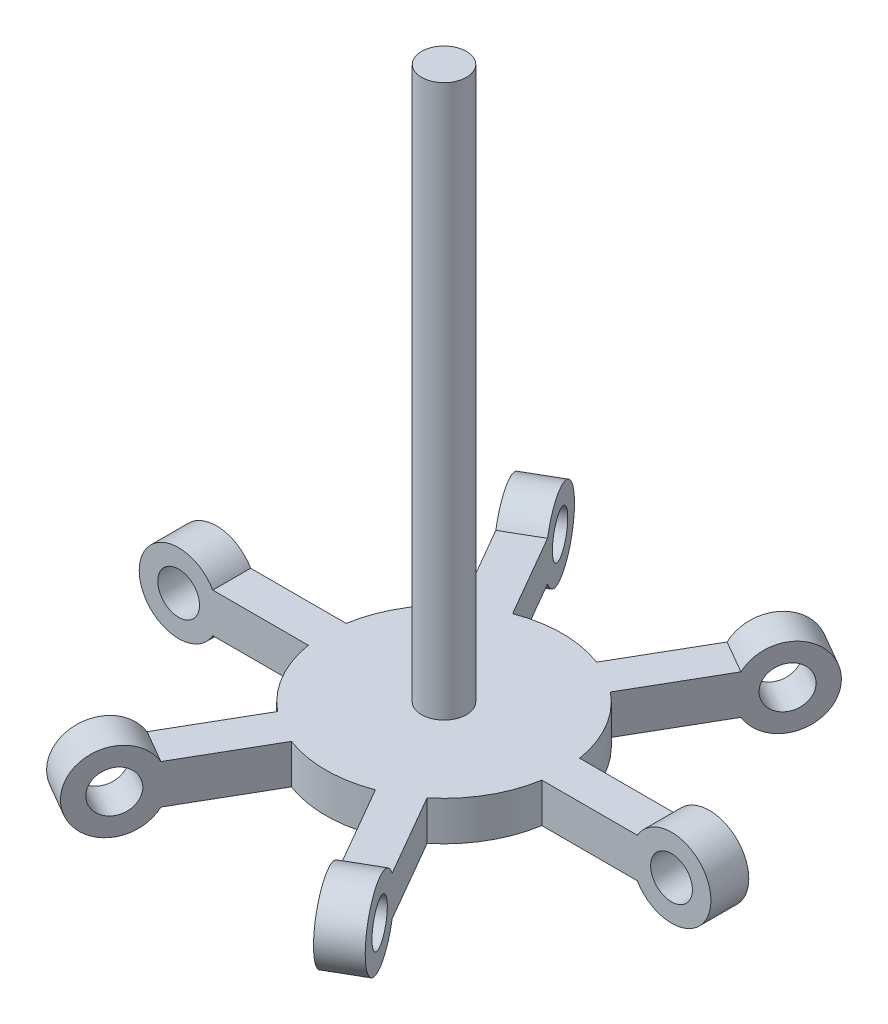
ISO-10303-21;
HEADER;
FILE_DESCRIPTION(('STEP AP214'),'2;1');
FILE_NAME('part.step','',(''),(''),'','','');
FILE_SCHEMA(('AUTOMOTIVE_DESIGN { 1 0 10303 214 1 1 1 1 }'));
ENDSEC;
DATA;
#1=APPLICATION_CONTEXT('core data for automotive mechanical design processes');
#2=APPLICATION_PROTOCOL_DEFINITION('international standard','automotive_design',2000,#1);
#3=PRODUCT_CONTEXT('',#1,'mechanical');
#4=PRODUCT('Part','Part','',(#3));
#5=PRODUCT_RELATED_PRODUCT_CATEGORY('part','',(#4));
#6=PRODUCT_DEFINITION_FORMATION('','',#4);
#7=PRODUCT_DEFINITION_CONTEXT('part definition',#1,'design');
#8=PRODUCT_DEFINITION('design','',#6,#7);
#9=PRODUCT_DEFINITION_SHAPE('','',#8);
#10=(LENGTH_UNIT() NAMED_UNIT(*) SI_UNIT(.MILLI.,.METRE.));
#11=(NAMED_UNIT(*) PLANE_ANGLE_UNIT() SI_UNIT($,.RADIAN.));
#12=(NAMED_UNIT(*) SI_UNIT($,.STERADIAN.) SOLID_ANGLE_UNIT());
#13=UNCERTAINTY_MEASURE_WITH_UNIT(LENGTH_MEASURE(1.E-05),#10,'distance_accuracy_value','');
#14=(GEOMETRIC_REPRESENTATION_CONTEXT(3) GLOBAL_UNCERTAINTY_ASSIGNED_CONTEXT((#13)) GLOBAL_UNIT_ASSIGNED_CONTEXT((#10,
#11,#12)) REPRESENTATION_CONTEXT('',''));
#15=CARTESIAN_POINT('',(0.,0.,0.));
#16=DIRECTION('',(0.,0.,1.));
#17=DIRECTION('',(1.,0.,0.));
#18=AXIS2_PLACEMENT_3D('',#15,#16,#17);
#19=CARTESIAN_POINT('',(0.,5.,0.));
#20=DIRECTION('',(0.,-1.,0.));
#21=DIRECTION('',(0.,0.,-1.));
#22=AXIS2_PLACEMENT_3D('',#19,#20,#21);
#23=CYLINDRICAL_SURFACE('',#22,30.);
#24=DIRECTION('',(0.,-1.,0.));
#25=VECTOR('',#24,1.);
#26=CARTESIAN_POINT('',(10.6498332769387,5.,28.0460523277949));
#27=LINE('',#26,#25);
#28=CARTESIAN_POINT('',(10.6498332769387,5.,28.0460523277949));
#29=VERTEX_POINT('',#28);
#30=CARTESIAN_POINT('',(10.6498332769387,-5.,28.0460523277949));
#31=VERTEX_POINT('',#30);
#32=EDGE_CURVE('E231',#29,#31,#27,.T.);
#33=ORIENTED_EDGE('',*,*,#32,.F.);
#34=CARTESIAN_POINT('',(0.,5.,0.));
#35=DIRECTION('',(0.,1.,0.));
#36=DIRECTION('',(0.,0.,1.));
#37=AXIS2_PLACEMENT_3D('',#34,#35,#36);
#38=CIRCLE('',#37,30.);
#39=CARTESIAN_POINT('',(-10.6498332769381,5.,28.0460523277951));
#40=VERTEX_POINT('',#39);
#41=EDGE_CURVE('E405',#40,#29,#38,.T.);
#42=ORIENTED_EDGE('',*,*,#41,.F.);
#43=DIRECTION('',(0.,-1.,0.));
#44=VECTOR('',#43,1.);
#45=CARTESIAN_POINT('',(-10.6498332769381,5.,28.0460523277951));
#46=LINE('',#45,#44);
#47=CARTESIAN_POINT('',(-10.6498332769381,-5.,28.0460523277951));
#48=VERTEX_POINT('',#47);
#49=EDGE_CURVE('E245',#48,#40,#46,.F.);
#50=ORIENTED_EDGE('',*,*,#49,.F.);
#51=CARTESIAN_POINT('',(0.,-5.,0.));
#52=DIRECTION('',(0.,1.,0.));
#53=DIRECTION('',(0.,0.,1.));
#54=AXIS2_PLACEMENT_3D('',#51,#52,#53);
#55=CIRCLE('',#54,30.);
#56=EDGE_CURVE('E225',#48,#31,#55,.T.);
#57=ORIENTED_EDGE('',*,*,#56,.T.);
#58=EDGE_LOOP('',(#33,#42,#50,#57));
#59=FACE_BOUND('',#58,.T.);
#60=ADVANCED_FACE('F41',(#59),#23,.T.);
#61=DIRECTION('',(0.,-1.,0.));
#62=VECTOR('',#61,1.);
#63=CARTESIAN_POINT('',(18.9636771532693,5.,23.2460523277948));
#64=LINE('',#63,#62);
#65=CARTESIAN_POINT('',(18.9636771532693,-5.,23.2460523277948));
#66=VERTEX_POINT('',#65);
#67=CARTESIAN_POINT('',(18.9636771532693,5.,23.2460523277948));
#68=VERTEX_POINT('',#67);
#69=EDGE_CURVE('E212',#66,#68,#64,.F.);
#70=ORIENTED_EDGE('',*,*,#69,.F.);
#71=CARTESIAN_POINT('',(29.6135104302074,-5.,4.8));
#72=VERTEX_POINT('',#71);
#73=EDGE_CURVE('E218',#66,#72,#55,.T.);
#74=ORIENTED_EDGE('',*,*,#73,.T.);
#75=DIRECTION('',(0.,-1.,0.));
#76=VECTOR('',#75,1.);
#77=CARTESIAN_POINT('',(29.6135104302074,5.,4.8));
#78=LINE('',#77,#76);
#79=CARTESIAN_POINT('',(29.6135104302074,5.,4.8));
#80=VERTEX_POINT('',#79);
#81=EDGE_CURVE('E226',#80,#72,#78,.T.);
#82=ORIENTED_EDGE('',*,*,#81,.F.);
#83=EDGE_CURVE('E52',#68,#80,#38,.T.);
#84=ORIENTED_EDGE('',*,*,#83,.F.);
#85=EDGE_LOOP('',(#70,#74,#82,#84));
#86=FACE_BOUND('',#85,.T.);
#87=ADVANCED_FACE('F230',(#86),#23,.T.);
#88=DIRECTION('',(0.,-1.,0.));
#89=VECTOR('',#88,1.);
#90=CARTESIAN_POINT('',(-18.9636771532688,5.,23.2460523277952));
#91=LINE('',#90,#89);
#92=CARTESIAN_POINT('',(-18.9636771532688,5.,23.2460523277952));
#93=VERTEX_POINT('',#92);
#94=CARTESIAN_POINT('',(-18.9636771532688,-5.,23.2460523277952));
#95=VERTEX_POINT('',#94);
#96=EDGE_CURVE('E251',#93,#95,#91,.T.);
#97=ORIENTED_EDGE('',*,*,#96,.F.);
#98=CARTESIAN_POINT('',(-29.6135104302074,5.,4.8));
#99=VERTEX_POINT('',#98);
#100=EDGE_CURVE('E441',#99,#93,#38,.T.);
#101=ORIENTED_EDGE('',*,*,#100,.F.);
#102=DIRECTION('',(0.,-1.,0.));
#103=VECTOR('',#102,1.);
#104=CARTESIAN_POINT('',(-29.6135104302074,5.,4.8));
#105=LINE('',#104,#103);
#106=CARTESIAN_POINT('',(-29.6135104302074,-5.,4.8));
#107=VERTEX_POINT('',#106);
#108=EDGE_CURVE('E260',#107,#99,#105,.F.);
#109=ORIENTED_EDGE('',*,*,#108,.F.);
#110=EDGE_CURVE('E455',#107,#95,#55,.T.);
#111=ORIENTED_EDGE('',*,*,#110,.T.);
#112=EDGE_LOOP('',(#97,#101,#109,#111));
#113=FACE_BOUND('',#112,.T.);
#114=ADVANCED_FACE('F475',(#113),#23,.T.);
#115=DIRECTION('',(0.,-1.,0.));
#116=VECTOR('',#115,1.);
#117=CARTESIAN_POINT('',(-29.6135104302074,5.,-4.8));
#118=LINE('',#117,#116);
#119=CARTESIAN_POINT('',(-29.6135104302074,5.,-4.8));
#120=VERTEX_POINT('',#119);
#121=CARTESIAN_POINT('',(-29.6135104302074,-5.,-4.8));
#122=VERTEX_POINT('',#121);
#123=EDGE_CURVE('E266',#120,#122,#118,.T.);
#124=ORIENTED_EDGE('',*,*,#123,.F.);
#125=CARTESIAN_POINT('',(-18.9636771532691,5.,-23.2460523277949));
#126=VERTEX_POINT('',#125);
#127=EDGE_CURVE('E439',#126,#120,#38,.T.);
#128=ORIENTED_EDGE('',*,*,#127,.F.);
#129=DIRECTION('',(0.,-1.,0.));
#130=VECTOR('',#129,1.);
#131=CARTESIAN_POINT('',(-18.9636771532691,5.,-23.2460523277949));
#132=LINE('',#131,#130);
#133=CARTESIAN_POINT('',(-18.9636771532691,-5.,-23.2460523277949));
#134=VERTEX_POINT('',#133);
#135=EDGE_CURVE('E275',#134,#126,#132,.F.);
#136=ORIENTED_EDGE('',*,*,#135,.F.);
#137=EDGE_CURVE('E456',#134,#122,#55,.T.);
#138=ORIENTED_EDGE('',*,*,#137,.T.);
#139=EDGE_LOOP('',(#124,#128,#136,#138));
#140=FACE_BOUND('',#139,.T.);
#141=ADVANCED_FACE('F463',(#140),#23,.T.);
#142=DIRECTION('',(0.,-1.,0.));
#143=VECTOR('',#142,1.);
#144=CARTESIAN_POINT('',(-10.6498332769385,5.,-28.046052327795));
#145=LINE('',#144,#143);
#146=CARTESIAN_POINT('',(-10.6498332769385,5.,-28.046052327795));
#147=VERTEX_POINT('',#146);
#148=CARTESIAN_POINT('',(-10.6498332769385,-5.,-28.046052327795));
#149=VERTEX_POINT('',#148);
#150=EDGE_CURVE('E281',#147,#149,#145,.T.);
#151=ORIENTED_EDGE('',*,*,#150,.F.);
#152=CARTESIAN_POINT('',(10.6498332769383,5.,-28.046052327795));
#153=VERTEX_POINT('',#152);
#154=EDGE_CURVE('E50',#153,#147,#38,.T.);
#155=ORIENTED_EDGE('',*,*,#154,.F.);
#156=DIRECTION('',(0.,-1.,0.));
#157=VECTOR('',#156,1.);
#158=CARTESIAN_POINT('',(10.6498332769383,5.,-28.046052327795));
#159=LINE('',#158,#157);
#160=CARTESIAN_POINT('',(10.6498332769383,-5.,-28.046052327795));
#161=VERTEX_POINT('',#160);
#162=EDGE_CURVE('E290',#161,#153,#159,.F.);
#163=ORIENTED_EDGE('',*,*,#162,.F.);
#164=EDGE_CURVE('E325',#161,#149,#55,.T.);
#165=ORIENTED_EDGE('',*,*,#164,.T.);
#166=EDGE_LOOP('',(#151,#155,#163,#165));
#167=FACE_BOUND('',#166,.T.);
#168=ADVANCED_FACE('F437',(#167),#23,.T.);
#169=DIRECTION('',(0.,-1.,0.));
#170=VECTOR('',#169,1.);
#171=CARTESIAN_POINT('',(18.9636771532689,5.,-23.2460523277951));
#172=LINE('',#171,#170);
#173=CARTESIAN_POINT('',(18.9636771532689,5.,-23.2460523277951));
#174=VERTEX_POINT('',#173);
#175=CARTESIAN_POINT('',(18.9636771532689,-5.,-23.2460523277951));
#176=VERTEX_POINT('',#175);
#177=EDGE_CURVE('E296',#174,#176,#172,.T.);
#178=ORIENTED_EDGE('',*,*,#177,.F.);
#179=CARTESIAN_POINT('',(29.6135104302074,5.,-4.8));
#180=VERTEX_POINT('',#179);
#181=EDGE_CURVE('E11',#180,#174,#38,.T.);
#182=ORIENTED_EDGE('',*,*,#181,.F.);
#183=DIRECTION('',(0.,-1.,0.));
#184=VECTOR('',#183,1.);
#185=CARTESIAN_POINT('',(29.6135104302074,5.,-4.8));
#186=LINE('',#185,#184);
#187=CARTESIAN_POINT('',(29.6135104302074,-5.,-4.8));
#188=VERTEX_POINT('',#187);
#189=EDGE_CURVE('E319',#188,#180,#186,.F.);
#190=ORIENTED_EDGE('',*,*,#189,.F.);
#191=EDGE_CURVE('E228',#188,#176,#55,.T.);
#192=ORIENTED_EDGE('',*,*,#191,.T.);
#193=EDGE_LOOP('',(#178,#182,#190,#192));
#194=FACE_BOUND('',#193,.T.);
#195=ADVANCED_FACE('F43',(#194),#23,.T.);
#196=CARTESIAN_POINT('',(0.,5.,0.));
#197=DIRECTION('',(0.,1.,0.));
#198=DIRECTION('',(0.,0.,1.));
#199=AXIS2_PLACEMENT_3D('',#196,#197,#198);
#200=PLANE('',#199);
#201=CARTESIAN_POINT('',(0.,5.,0.));
#202=DIRECTION('',(0.,1.,0.));
#203=DIRECTION('',(0.,0.,1.));
#204=AXIS2_PLACEMENT_3D('',#201,#202,#203);
#205=CIRCLE('',#204,5.7);
#206=CARTESIAN_POINT('',(0.,5.,5.7));
#207=VERTEX_POINT('',#206);
#208=EDGE_CURVE('E787',#207,#207,#205,.T.);
#209=ORIENTED_EDGE('',*,*,#208,.F.);
#210=EDGE_LOOP('',(#209));
#211=FACE_BOUND('',#210,.T.);
#212=DIRECTION('',(-0.866025403784433,0.,0.50000000000001));
#213=VECTOR('',#212,1.);
#214=CARTESIAN_POINT('',(31.0767949192436,5.,44.2265877365271));
#215=LINE('',#214,#213);
#216=CARTESIAN_POINT('',(31.0767949192436,5.,44.2265877365271));
#217=VERTEX_POINT('',#216);
#218=CARTESIAN_POINT('',(22.7629510429131,5.,49.0265877365271));
#219=VERTEX_POINT('',#218);
#220=EDGE_CURVE('E353',#217,#219,#215,.T.);
#221=ORIENTED_EDGE('',*,*,#220,.F.);
#222=DIRECTION('',(-0.50000000000001,0.,-0.866025403784433));
#223=VECTOR('',#222,1.);
#224=CARTESIAN_POINT('',(39.156921938166,5.,58.2217782649103));
#225=LINE('',#224,#223);
#226=EDGE_CURVE('E232',#217,#68,#225,.T.);
#227=ORIENTED_EDGE('',*,*,#226,.T.);
#228=ORIENTED_EDGE('',*,*,#83,.T.);
#229=DIRECTION('',(1.,0.,0.));
#230=VECTOR('',#229,1.);
#231=CARTESIAN_POINT('',(70.,5.,4.8));
#232=LINE('',#231,#230);
#233=CARTESIAN_POINT('',(53.8397459621556,5.,4.8));
#234=VERTEX_POINT('',#233);
#235=EDGE_CURVE('E314',#80,#234,#232,.T.);
#236=ORIENTED_EDGE('',*,*,#235,.T.);
#237=DIRECTION('',(0.,0.,1.));
#238=VECTOR('',#237,1.);
#239=CARTESIAN_POINT('',(53.8397459621556,5.,-4.79999999999999));
#240=LINE('',#239,#238);
#241=CARTESIAN_POINT('',(53.8397459621556,5.,-4.8));
#242=VERTEX_POINT('',#241);
#243=EDGE_CURVE('E311',#242,#234,#240,.T.);
#244=ORIENTED_EDGE('',*,*,#243,.F.);
#245=DIRECTION('',(-1.,0.,0.));
#246=VECTOR('',#245,1.);
#247=CARTESIAN_POINT('',(70.,5.,-4.8));
#248=LINE('',#247,#246);
#249=EDGE_CURVE('E316',#242,#180,#248,.T.);
#250=ORIENTED_EDGE('',*,*,#249,.T.);
#251=ORIENTED_EDGE('',*,*,#181,.T.);
#252=DIRECTION('',(0.499999999999998,0.,-0.86602540378444));
#253=VECTOR('',#252,1.);
#254=CARTESIAN_POINT('',(39.1569219381652,5.,-58.2217782649108));
#255=LINE('',#254,#253);
#256=CARTESIAN_POINT('',(31.076794919243,5.,-44.2265877365275));
#257=VERTEX_POINT('',#256);
#258=EDGE_CURVE('E285',#174,#257,#255,.T.);
#259=ORIENTED_EDGE('',*,*,#258,.T.);
#260=DIRECTION('',(0.86602540378444,0.,0.499999999999998));
#261=VECTOR('',#260,1.);
#262=CARTESIAN_POINT('',(22.7629510429124,5.,-49.0265877365275));
#263=LINE('',#262,#261);
#264=CARTESIAN_POINT('',(22.7629510429124,5.,-49.0265877365275));
#265=VERTEX_POINT('',#264);
#266=EDGE_CURVE('E396',#265,#257,#263,.T.);
#267=ORIENTED_EDGE('',*,*,#266,.F.);
#268=DIRECTION('',(-0.499999999999998,0.,0.86602540378444));
#269=VECTOR('',#268,1.);
#270=CARTESIAN_POINT('',(30.8430780618346,5.,-63.0217782649108));
#271=LINE('',#270,#269);
#272=EDGE_CURVE('E287',#265,#153,#271,.T.);
#273=ORIENTED_EDGE('',*,*,#272,.T.);
#274=ORIENTED_EDGE('',*,*,#154,.T.);
#275=DIRECTION('',(-0.500000000000004,0.,-0.866025403784436));
#276=VECTOR('',#275,1.);
#277=CARTESIAN_POINT('',(-30.843078061835,5.,-63.0217782649106));
#278=LINE('',#277,#276);
#279=CARTESIAN_POINT('',(-22.7629510429127,5.,-49.0265877365273));
#280=VERTEX_POINT('',#279);
#281=EDGE_CURVE('E270',#147,#280,#278,.T.);
#282=ORIENTED_EDGE('',*,*,#281,.T.);
#283=DIRECTION('',(0.866025403784436,0.,-0.500000000000004));
#284=VECTOR('',#283,1.);
#285=CARTESIAN_POINT('',(-31.0767949192433,5.,-44.2265877365273));
#286=LINE('',#285,#284);
#287=CARTESIAN_POINT('',(-31.0767949192433,5.,-44.2265877365273));
#288=VERTEX_POINT('',#287);
#289=EDGE_CURVE('E385',#288,#280,#286,.T.);
#290=ORIENTED_EDGE('',*,*,#289,.F.);
#291=DIRECTION('',(0.500000000000004,0.,0.866025403784436));
#292=VECTOR('',#291,1.);
#293=CARTESIAN_POINT('',(-39.1569219381656,5.,-58.2217782649105));
#294=LINE('',#293,#292);
#295=EDGE_CURVE('E272',#288,#126,#294,.T.);
#296=ORIENTED_EDGE('',*,*,#295,.T.);
#297=ORIENTED_EDGE('',*,*,#127,.T.);
#298=DIRECTION('',(-1.,0.,0.));
#299=VECTOR('',#298,1.);
#300=CARTESIAN_POINT('',(-70.,5.,-4.8));
#301=LINE('',#300,#299);
#302=CARTESIAN_POINT('',(-53.8397459621556,5.,-4.8));
#303=VERTEX_POINT('',#302);
#304=EDGE_CURVE('E255',#120,#303,#301,.T.);
#305=ORIENTED_EDGE('',*,*,#304,.T.);
#306=DIRECTION('',(0.,0.,-1.));
#307=VECTOR('',#306,1.);
#308=CARTESIAN_POINT('',(-53.8397459621556,5.,4.79999999999999));
#309=LINE('',#308,#307);
#310=CARTESIAN_POINT('',(-53.8397459621556,5.,4.8));
#311=VERTEX_POINT('',#310);
#312=EDGE_CURVE('E374',#311,#303,#309,.T.);
#313=ORIENTED_EDGE('',*,*,#312,.F.);
#314=DIRECTION('',(1.,0.,0.));
#315=VECTOR('',#314,1.);
#316=CARTESIAN_POINT('',(-70.,5.,4.8));
#317=LINE('',#316,#315);
#318=EDGE_CURVE('E257',#311,#99,#317,.T.);
#319=ORIENTED_EDGE('',*,*,#318,.T.);
#320=ORIENTED_EDGE('',*,*,#100,.T.);
#321=DIRECTION('',(-0.499999999999992,0.,0.866025403784443));
#322=VECTOR('',#321,1.);
#323=CARTESIAN_POINT('',(-39.1569219381648,5.,58.2217782649111));
#324=LINE('',#323,#322);
#325=CARTESIAN_POINT('',(-31.0767949192427,5.,44.2265877365277));
#326=VERTEX_POINT('',#325);
#327=EDGE_CURVE('E240',#93,#326,#324,.T.);
#328=ORIENTED_EDGE('',*,*,#327,.T.);
#329=DIRECTION('',(-0.866025403784443,0.,-0.499999999999992));
#330=VECTOR('',#329,1.);
#331=CARTESIAN_POINT('',(-22.7629510429121,5.,49.0265877365276));
#332=LINE('',#331,#330);
#333=CARTESIAN_POINT('',(-22.7629510429121,5.,49.0265877365276));
#334=VERTEX_POINT('',#333);
#335=EDGE_CURVE('E363',#334,#326,#332,.T.);
#336=ORIENTED_EDGE('',*,*,#335,.F.);
#337=DIRECTION('',(0.499999999999992,0.,-0.866025403784443));
#338=VECTOR('',#337,1.);
#339=CARTESIAN_POINT('',(-30.8430780618341,5.,63.021778264911));
#340=LINE('',#339,#338);
#341=EDGE_CURVE('E242',#334,#40,#340,.T.);
#342=ORIENTED_EDGE('',*,*,#341,.T.);
#343=ORIENTED_EDGE('',*,*,#41,.T.);
#344=DIRECTION('',(0.50000000000001,0.,0.866025403784433));
#345=VECTOR('',#344,1.);
#346=CARTESIAN_POINT('',(30.8430780618354,5.,63.0217782649103));
#347=LINE('',#346,#345);
#348=EDGE_CURVE('E67',#29,#219,#347,.T.);
#349=ORIENTED_EDGE('',*,*,#348,.T.);
#350=EDGE_LOOP('',(#221,#227,#228,#236,#244,#250,#251,#259,#267,#273,#274,#282,#290,#296,#297,
#305,#313,#319,#320,#328,#336,#342,#343,#349));
#351=FACE_BOUND('',#350,.T.);
#352=ADVANCED_FACE('F403',(#211,#351),#200,.T.);
#353=CARTESIAN_POINT('',(0.,-5.,0.));
#354=DIRECTION('',(0.,1.,0.));
#355=DIRECTION('',(0.,0.,1.));
#356=AXIS2_PLACEMENT_3D('',#353,#354,#355);
#357=PLANE('',#356);
#358=DIRECTION('',(-0.50000000000001,0.,-0.866025403784433));
#359=VECTOR('',#358,1.);
#360=CARTESIAN_POINT('',(39.156921938166,-5.,58.2217782649103));
#361=LINE('',#360,#359);
#362=CARTESIAN_POINT('',(31.0767949192436,-5.,44.2265877365271));
#363=VERTEX_POINT('',#362);
#364=EDGE_CURVE('E207',#363,#66,#361,.T.);
#365=ORIENTED_EDGE('',*,*,#364,.F.);
#366=DIRECTION('',(-0.866025403784433,0.,0.50000000000001));
#367=VECTOR('',#366,1.);
#368=CARTESIAN_POINT('',(31.0767949192436,-5.,44.2265877365271));
#369=LINE('',#368,#367);
#370=CARTESIAN_POINT('',(22.7629510429131,-5.,49.0265877365271));
#371=VERTEX_POINT('',#370);
#372=EDGE_CURVE('E59',#363,#371,#369,.T.);
#373=ORIENTED_EDGE('',*,*,#372,.T.);
#374=DIRECTION('',(0.50000000000001,0.,0.866025403784433));
#375=VECTOR('',#374,1.);
#376=CARTESIAN_POINT('',(30.8430780618354,-5.,63.0217782649103));
#377=LINE('',#376,#375);
#378=EDGE_CURVE('E215',#31,#371,#377,.T.);
#379=ORIENTED_EDGE('',*,*,#378,.F.);
#380=ORIENTED_EDGE('',*,*,#56,.F.);
#381=DIRECTION('',(0.499999999999992,0.,-0.866025403784443));
#382=VECTOR('',#381,1.);
#383=CARTESIAN_POINT('',(-30.8430780618341,-5.,63.021778264911));
#384=LINE('',#383,#382);
#385=CARTESIAN_POINT('',(-22.7629510429121,-5.,49.0265877365276));
#386=VERTEX_POINT('',#385);
#387=EDGE_CURVE('E243',#386,#48,#384,.T.);
#388=ORIENTED_EDGE('',*,*,#387,.F.);
#389=DIRECTION('',(-0.866025403784443,0.,-0.499999999999992));
#390=VECTOR('',#389,1.);
#391=CARTESIAN_POINT('',(-22.7629510429121,-5.,49.0265877365276));
#392=LINE('',#391,#390);
#393=CARTESIAN_POINT('',(-31.0767949192427,-5.,44.2265877365277));
#394=VERTEX_POINT('',#393);
#395=EDGE_CURVE('E359',#386,#394,#392,.T.);
#396=ORIENTED_EDGE('',*,*,#395,.T.);
#397=DIRECTION('',(-0.499999999999992,0.,0.866025403784443));
#398=VECTOR('',#397,1.);
#399=CARTESIAN_POINT('',(-39.1569219381648,-5.,58.2217782649111));
#400=LINE('',#399,#398);
#401=EDGE_CURVE('E235',#95,#394,#400,.T.);
#402=ORIENTED_EDGE('',*,*,#401,.F.);
#403=ORIENTED_EDGE('',*,*,#110,.F.);
#404=DIRECTION('',(1.,0.,0.));
#405=VECTOR('',#404,1.);
#406=CARTESIAN_POINT('',(-70.,-5.,4.8));
#407=LINE('',#406,#405);
#408=CARTESIAN_POINT('',(-53.8397459621556,-5.,4.8));
#409=VERTEX_POINT('',#408);
#410=EDGE_CURVE('E258',#409,#107,#407,.T.);
#411=ORIENTED_EDGE('',*,*,#410,.F.);
#412=DIRECTION('',(0.,0.,-1.));
#413=VECTOR('',#412,1.);
#414=CARTESIAN_POINT('',(-53.8397459621556,-5.,4.79999999999999));
#415=LINE('',#414,#413);
#416=CARTESIAN_POINT('',(-53.8397459621556,-5.,-4.8));
#417=VERTEX_POINT('',#416);
#418=EDGE_CURVE('E370',#409,#417,#415,.T.);
#419=ORIENTED_EDGE('',*,*,#418,.T.);
#420=DIRECTION('',(-1.,0.,0.));
#421=VECTOR('',#420,1.);
#422=CARTESIAN_POINT('',(-70.,-5.,-4.8));
#423=LINE('',#422,#421);
#424=EDGE_CURVE('E254',#122,#417,#423,.T.);
#425=ORIENTED_EDGE('',*,*,#424,.F.);
#426=ORIENTED_EDGE('',*,*,#137,.F.);
#427=DIRECTION('',(0.500000000000004,0.,0.866025403784436));
#428=VECTOR('',#427,1.);
#429=CARTESIAN_POINT('',(-39.1569219381656,-5.,-58.2217782649105));
#430=LINE('',#429,#428);
#431=CARTESIAN_POINT('',(-31.0767949192433,-5.,-44.2265877365273));
#432=VERTEX_POINT('',#431);
#433=EDGE_CURVE('E273',#432,#134,#430,.T.);
#434=ORIENTED_EDGE('',*,*,#433,.F.);
#435=DIRECTION('',(0.866025403784436,0.,-0.500000000000004));
#436=VECTOR('',#435,1.);
#437=CARTESIAN_POINT('',(-31.0767949192433,-5.,-44.2265877365273));
#438=LINE('',#437,#436);
#439=CARTESIAN_POINT('',(-22.7629510429127,-5.,-49.0265877365273));
#440=VERTEX_POINT('',#439);
#441=EDGE_CURVE('E381',#432,#440,#438,.T.);
#442=ORIENTED_EDGE('',*,*,#441,.T.);
#443=DIRECTION('',(-0.500000000000004,0.,-0.866025403784436));
#444=VECTOR('',#443,1.);
#445=CARTESIAN_POINT('',(-30.843078061835,-5.,-63.0217782649106));
#446=LINE('',#445,#444);
#447=EDGE_CURVE('E269',#149,#440,#446,.T.);
#448=ORIENTED_EDGE('',*,*,#447,.F.);
#449=ORIENTED_EDGE('',*,*,#164,.F.);
#450=DIRECTION('',(-0.499999999999998,0.,0.86602540378444));
#451=VECTOR('',#450,1.);
#452=CARTESIAN_POINT('',(30.8430780618346,-5.,-63.0217782649108));
#453=LINE('',#452,#451);
#454=CARTESIAN_POINT('',(22.7629510429124,-5.,-49.0265877365275));
#455=VERTEX_POINT('',#454);
#456=EDGE_CURVE('E288',#455,#161,#453,.T.);
#457=ORIENTED_EDGE('',*,*,#456,.F.);
#458=DIRECTION('',(0.86602540378444,0.,0.499999999999998));
#459=VECTOR('',#458,1.);
#460=CARTESIAN_POINT('',(22.7629510429124,-5.,-49.0265877365275));
#461=LINE('',#460,#459);
#462=CARTESIAN_POINT('',(31.076794919243,-5.,-44.2265877365275));
#463=VERTEX_POINT('',#462);
#464=EDGE_CURVE('E392',#455,#463,#461,.T.);
#465=ORIENTED_EDGE('',*,*,#464,.T.);
#466=DIRECTION('',(0.499999999999998,0.,-0.86602540378444));
#467=VECTOR('',#466,1.);
#468=CARTESIAN_POINT('',(39.1569219381652,-5.,-58.2217782649108));
#469=LINE('',#468,#467);
#470=EDGE_CURVE('E284',#176,#463,#469,.T.);
#471=ORIENTED_EDGE('',*,*,#470,.F.);
#472=ORIENTED_EDGE('',*,*,#191,.F.);
#473=DIRECTION('',(-1.,0.,0.));
#474=VECTOR('',#473,1.);
#475=CARTESIAN_POINT('',(70.,-5.,-4.8));
#476=LINE('',#475,#474);
#477=CARTESIAN_POINT('',(53.8397459621556,-5.,-4.8));
#478=VERTEX_POINT('',#477);
#479=EDGE_CURVE('E317',#478,#188,#476,.T.);
#480=ORIENTED_EDGE('',*,*,#479,.F.);
#481=DIRECTION('',(0.,0.,1.));
#482=VECTOR('',#481,1.);
#483=CARTESIAN_POINT('',(53.8397459621556,-5.,-4.79999999999999));
#484=LINE('',#483,#482);
#485=CARTESIAN_POINT('',(53.8397459621556,-5.,4.8));
#486=VERTEX_POINT('',#485);
#487=EDGE_CURVE('E306',#478,#486,#484,.T.);
#488=ORIENTED_EDGE('',*,*,#487,.T.);
#489=DIRECTION('',(1.,0.,0.));
#490=VECTOR('',#489,1.);
#491=CARTESIAN_POINT('',(70.,-5.,4.8));
#492=LINE('',#491,#490);
#493=EDGE_CURVE('E221',#72,#486,#492,.T.);
#494=ORIENTED_EDGE('',*,*,#493,.F.);
#495=ORIENTED_EDGE('',*,*,#73,.F.);
#496=EDGE_LOOP('',(#365,#373,#379,#380,#388,#396,#402,#403,#411,#419,#425,#426,#434,#442,#448,
#449,#457,#465,#471,#472,#480,#488,#494,#495));
#497=FACE_BOUND('',#496,.T.);
#498=ADVANCED_FACE('F219',(#497),#357,.F.);
#499=CARTESIAN_POINT('',(70.,5.,4.8));
#500=DIRECTION('',(0.,0.,-1.));
#501=DIRECTION('',(-1.,0.,0.));
#502=AXIS2_PLACEMENT_3D('',#499,#500,#501);
#503=PLANE('',#502);
#504=CARTESIAN_POINT('',(62.5,0.,4.80000000000001));
#505=DIRECTION('',(0.,0.,1.));
#506=DIRECTION('',(1.,0.,0.));
#507=AXIS2_PLACEMENT_3D('',#504,#505,#506);
#508=CIRCLE('',#507,5.3);
#509=CARTESIAN_POINT('',(67.8,0.,4.80000000000001));
#510=VERTEX_POINT('',#509);
#511=EDGE_CURVE('E299',#510,#510,#508,.T.);
#512=ORIENTED_EDGE('',*,*,#511,.F.);
#513=EDGE_LOOP('',(#512));
#514=FACE_BOUND('',#513,.T.);
#515=ORIENTED_EDGE('',*,*,#493,.T.);
#516=CARTESIAN_POINT('',(62.5,0.,4.80000000000001));
#517=DIRECTION('',(0.,0.,1.));
#518=DIRECTION('',(1.,0.,0.));
#519=AXIS2_PLACEMENT_3D('',#516,#517,#518);
#520=CIRCLE('',#519,9.99999999999999);
#521=EDGE_CURVE('E307',#486,#234,#520,.T.);
#522=ORIENTED_EDGE('',*,*,#521,.T.);
#523=ORIENTED_EDGE('',*,*,#235,.F.);
#524=ORIENTED_EDGE('',*,*,#81,.T.);
#525=EDGE_LOOP('',(#515,#522,#523,#524));
#526=FACE_BOUND('',#525,.T.);
#527=ADVANCED_FACE('F407',(#514,#526),#503,.F.);
#528=CARTESIAN_POINT('',(70.,5.,-4.8));
#529=DIRECTION('',(0.,0.,1.));
#530=DIRECTION('',(1.,0.,0.));
#531=AXIS2_PLACEMENT_3D('',#528,#529,#530);
#532=PLANE('',#531);
#533=CARTESIAN_POINT('',(62.5,0.,-4.8));
#534=DIRECTION('',(0.,0.,1.));
#535=DIRECTION('',(1.,0.,0.));
#536=AXIS2_PLACEMENT_3D('',#533,#534,#535);
#537=CIRCLE('',#536,5.3);
#538=CARTESIAN_POINT('',(67.8,0.,-4.8));
#539=VERTEX_POINT('',#538);
#540=EDGE_CURVE('E302',#539,#539,#537,.T.);
#541=ORIENTED_EDGE('',*,*,#540,.T.);
#542=EDGE_LOOP('',(#541));
#543=FACE_BOUND('',#542,.T.);
#544=ORIENTED_EDGE('',*,*,#249,.F.);
#545=CARTESIAN_POINT('',(62.5,0.,-4.79999999999999));
#546=DIRECTION('',(0.,0.,1.));
#547=DIRECTION('',(1.,0.,0.));
#548=AXIS2_PLACEMENT_3D('',#545,#546,#547);
#549=CIRCLE('',#548,9.99999999999999);
#550=EDGE_CURVE('E303',#478,#242,#549,.T.);
#551=ORIENTED_EDGE('',*,*,#550,.F.);
#552=ORIENTED_EDGE('',*,*,#479,.T.);
#553=ORIENTED_EDGE('',*,*,#189,.T.);
#554=EDGE_LOOP('',(#544,#551,#552,#553));
#555=FACE_BOUND('',#554,.T.);
#556=ADVANCED_FACE('F416',(#543,#555),#532,.F.);
#557=CARTESIAN_POINT('',(62.5,0.,-4.79999999999999));
#558=DIRECTION('',(0.,0.,1.));
#559=DIRECTION('',(1.,0.,0.));
#560=AXIS2_PLACEMENT_3D('',#557,#558,#559);
#561=CYLINDRICAL_SURFACE('',#560,9.99999999999999);
#562=ORIENTED_EDGE('',*,*,#550,.T.);
#563=ORIENTED_EDGE('',*,*,#243,.T.);
#564=ORIENTED_EDGE('',*,*,#521,.F.);
#565=ORIENTED_EDGE('',*,*,#487,.F.);
#566=EDGE_LOOP('',(#562,#563,#564,#565));
#567=FACE_BOUND('',#566,.T.);
#568=ADVANCED_FACE('F411',(#567),#561,.T.);
#569=CARTESIAN_POINT('',(62.5,0.,-5.2));
#570=DIRECTION('',(0.,0.,1.));
#571=DIRECTION('',(1.,0.,0.));
#572=AXIS2_PLACEMENT_3D('',#569,#570,#571);
#573=CYLINDRICAL_SURFACE('',#572,5.3);
#574=ORIENTED_EDGE('',*,*,#511,.T.);
#575=EDGE_LOOP('',(#574));
#576=FACE_BOUND('',#575,.T.);
#577=ORIENTED_EDGE('',*,*,#540,.F.);
#578=EDGE_LOOP('',(#577));
#579=FACE_BOUND('',#578,.T.);
#580=ADVANCED_FACE('F578',(#576,#579),#573,.F.);
#581=CARTESIAN_POINT('',(39.1569219381652,5.,-58.2217782649108));
#582=DIRECTION('',(-0.86602540378444,0.,-0.499999999999998));
#583=DIRECTION('',(-0.499999999999998,0.,0.86602540378444));
#584=AXIS2_PLACEMENT_3D('',#581,#582,#583);
#585=PLANE('',#584);
#586=CARTESIAN_POINT('',(35.4069219381652,0.,-51.7265877365275));
#587=DIRECTION('',(0.86602540378444,0.,0.499999999999998));
#588=DIRECTION('',(0.499999999999998,0.,-0.86602540378444));
#589=AXIS2_PLACEMENT_3D('',#586,#587,#588);
#590=CIRCLE('',#589,5.3);
#591=CARTESIAN_POINT('',(38.0569219381652,0.,-56.316522376585));
#592=VERTEX_POINT('',#591);
#593=EDGE_CURVE('E332',#592,#592,#590,.T.);
#594=ORIENTED_EDGE('',*,*,#593,.F.);
#595=EDGE_LOOP('',(#594));
#596=FACE_BOUND('',#595,.T.);
#597=ORIENTED_EDGE('',*,*,#470,.T.);
#598=CARTESIAN_POINT('',(35.4069219381652,0.,-51.7265877365275));
#599=DIRECTION('',(0.86602540378444,0.,0.499999999999998));
#600=DIRECTION('',(0.499999999999998,0.,-0.86602540378444));
#601=AXIS2_PLACEMENT_3D('',#598,#599,#600);
#602=CIRCLE('',#601,9.99999999999999);
#603=EDGE_CURVE('E388',#463,#257,#602,.T.);
#604=ORIENTED_EDGE('',*,*,#603,.T.);
#605=ORIENTED_EDGE('',*,*,#258,.F.);
#606=ORIENTED_EDGE('',*,*,#177,.T.);
#607=EDGE_LOOP('',(#597,#604,#605,#606));
#608=FACE_BOUND('',#607,.T.);
#609=ADVANCED_FACE('F422',(#596,#608),#585,.F.);
#610=CARTESIAN_POINT('',(30.8430780618346,5.,-63.0217782649108));
#611=DIRECTION('',(0.86602540378444,0.,0.499999999999998));
#612=DIRECTION('',(0.499999999999998,0.,-0.86602540378444));
#613=AXIS2_PLACEMENT_3D('',#610,#611,#612);
#614=PLANE('',#613);
#615=CARTESIAN_POINT('',(27.0930780618346,0.,-56.5265877365275));
#616=DIRECTION('',(0.86602540378444,0.,0.499999999999998));
#617=DIRECTION('',(0.499999999999998,0.,-0.86602540378444));
#618=AXIS2_PLACEMENT_3D('',#615,#616,#617);
#619=CIRCLE('',#618,5.3);
#620=CARTESIAN_POINT('',(29.7430780618346,0.,-61.116522376585));
#621=VERTEX_POINT('',#620);
#622=EDGE_CURVE('E45',#621,#621,#619,.T.);
#623=ORIENTED_EDGE('',*,*,#622,.T.);
#624=EDGE_LOOP('',(#623));
#625=FACE_BOUND('',#624,.T.);
#626=ORIENTED_EDGE('',*,*,#272,.F.);
#627=CARTESIAN_POINT('',(27.0930780618346,0.,-56.5265877365275));
#628=DIRECTION('',(0.86602540378444,0.,0.499999999999998));
#629=DIRECTION('',(0.499999999999998,0.,-0.86602540378444));
#630=AXIS2_PLACEMENT_3D('',#627,#628,#629);
#631=CIRCLE('',#630,9.99999999999999);
#632=EDGE_CURVE('E389',#455,#265,#631,.T.);
#633=ORIENTED_EDGE('',*,*,#632,.F.);
#634=ORIENTED_EDGE('',*,*,#456,.T.);
#635=ORIENTED_EDGE('',*,*,#162,.T.);
#636=EDGE_LOOP('',(#626,#633,#634,#635));
#637=FACE_BOUND('',#636,.T.);
#638=ADVANCED_FACE('F433',(#625,#637),#614,.F.);
#639=CARTESIAN_POINT('',(-30.843078061835,5.,-63.0217782649106));
#640=DIRECTION('',(-0.866025403784436,0.,0.500000000000004));
#641=DIRECTION('',(0.500000000000004,0.,0.866025403784436));
#642=AXIS2_PLACEMENT_3D('',#639,#640,#641);
#643=PLANE('',#642);
#644=CARTESIAN_POINT('',(-27.093078061835,0.,-56.5265877365273));
#645=DIRECTION('',(0.866025403784436,0.,-0.500000000000004));
#646=DIRECTION('',(-0.500000000000004,0.,-0.866025403784436));
#647=AXIS2_PLACEMENT_3D('',#644,#645,#646);
#648=CIRCLE('',#647,5.3);
#649=CARTESIAN_POINT('',(-29.743078061835,0.,-61.1165223765848));
#650=VERTEX_POINT('',#649);
#651=EDGE_CURVE('E795',#650,#650,#648,.T.);
#652=ORIENTED_EDGE('',*,*,#651,.F.);
#653=EDGE_LOOP('',(#652));
#654=FACE_BOUND('',#653,.T.);
#655=ORIENTED_EDGE('',*,*,#447,.T.);
#656=CARTESIAN_POINT('',(-27.093078061835,0.,-56.5265877365273));
#657=DIRECTION('',(0.866025403784436,0.,-0.500000000000004));
#658=DIRECTION('',(-0.500000000000004,0.,-0.866025403784436));
#659=AXIS2_PLACEMENT_3D('',#656,#657,#658);
#660=CIRCLE('',#659,9.99999999999999);
#661=EDGE_CURVE('E377',#440,#280,#660,.T.);
#662=ORIENTED_EDGE('',*,*,#661,.T.);
#663=ORIENTED_EDGE('',*,*,#281,.F.);
#664=ORIENTED_EDGE('',*,*,#150,.T.);
#665=EDGE_LOOP('',(#655,#662,#663,#664));
#666=FACE_BOUND('',#665,.T.);
#667=ADVANCED_FACE('F591',(#654,#666),#643,.F.);
#668=CARTESIAN_POINT('',(-39.1569219381656,5.,-58.2217782649105));
#669=DIRECTION('',(0.866025403784436,0.,-0.500000000000004));
#670=DIRECTION('',(-0.500000000000004,0.,-0.866025403784436));
#671=AXIS2_PLACEMENT_3D('',#668,#669,#670);
#672=PLANE('',#671);
#673=CARTESIAN_POINT('',(-35.4069219381655,0.,-51.7265877365273));
#674=DIRECTION('',(0.866025403784436,0.,-0.500000000000004));
#675=DIRECTION('',(-0.500000000000004,0.,-0.866025403784436));
#676=AXIS2_PLACEMENT_3D('',#673,#674,#675);
#677=CIRCLE('',#676,5.3);
#678=CARTESIAN_POINT('',(-38.0569219381656,0.,-56.3165223765848));
#679=VERTEX_POINT('',#678);
#680=EDGE_CURVE('E337',#679,#679,#677,.T.);
#681=ORIENTED_EDGE('',*,*,#680,.T.);
#682=EDGE_LOOP('',(#681));
#683=FACE_BOUND('',#682,.T.);
#684=ORIENTED_EDGE('',*,*,#295,.F.);
#685=CARTESIAN_POINT('',(-35.4069219381655,0.,-51.7265877365273));
#686=DIRECTION('',(0.866025403784436,0.,-0.500000000000004));
#687=DIRECTION('',(-0.500000000000004,0.,-0.866025403784436));
#688=AXIS2_PLACEMENT_3D('',#685,#686,#687);
#689=CIRCLE('',#688,9.99999999999999);
#690=EDGE_CURVE('E378',#432,#288,#689,.T.);
#691=ORIENTED_EDGE('',*,*,#690,.F.);
#692=ORIENTED_EDGE('',*,*,#433,.T.);
#693=ORIENTED_EDGE('',*,*,#135,.T.);
#694=EDGE_LOOP('',(#684,#691,#692,#693));
#695=FACE_BOUND('',#694,.T.);
#696=ADVANCED_FACE('F602',(#683,#695),#672,.F.);
#697=CARTESIAN_POINT('',(-70.,5.,-4.8));
#698=DIRECTION('',(0.,0.,1.));
#699=DIRECTION('',(1.,0.,0.));
#700=AXIS2_PLACEMENT_3D('',#697,#698,#699);
#701=PLANE('',#700);
#702=CARTESIAN_POINT('',(-62.5,0.,-4.80000000000001));
#703=DIRECTION('',(0.,0.,-1.));
#704=DIRECTION('',(-1.,0.,0.));
#705=AXIS2_PLACEMENT_3D('',#702,#703,#704);
#706=CIRCLE('',#705,5.3);
#707=CARTESIAN_POINT('',(-67.8,0.,-4.80000000000001));
#708=VERTEX_POINT('',#707);
#709=EDGE_CURVE('E798',#708,#708,#706,.T.);
#710=ORIENTED_EDGE('',*,*,#709,.F.);
#711=EDGE_LOOP('',(#710));
#712=FACE_BOUND('',#711,.T.);
#713=ORIENTED_EDGE('',*,*,#424,.T.);
#714=CARTESIAN_POINT('',(-62.5,0.,-4.80000000000001));
#715=DIRECTION('',(0.,0.,-1.));
#716=DIRECTION('',(-1.,0.,0.));
#717=AXIS2_PLACEMENT_3D('',#714,#715,#716);
#718=CIRCLE('',#717,9.99999999999999);
#719=EDGE_CURVE('E366',#417,#303,#718,.T.);
#720=ORIENTED_EDGE('',*,*,#719,.T.);
#721=ORIENTED_EDGE('',*,*,#304,.F.);
#722=ORIENTED_EDGE('',*,*,#123,.T.);
#723=EDGE_LOOP('',(#713,#720,#721,#722));
#724=FACE_BOUND('',#723,.T.);
#725=ADVANCED_FACE('F466',(#712,#724),#701,.F.);
#726=CARTESIAN_POINT('',(-70.,5.,4.8));
#727=DIRECTION('',(0.,0.,-1.));
#728=DIRECTION('',(-1.,0.,0.));
#729=AXIS2_PLACEMENT_3D('',#726,#727,#728);
#730=PLANE('',#729);
#731=CARTESIAN_POINT('',(-62.5,0.,4.8));
#732=DIRECTION('',(0.,0.,-1.));
#733=DIRECTION('',(-1.,0.,0.));
#734=AXIS2_PLACEMENT_3D('',#731,#732,#733);
#735=CIRCLE('',#734,5.3);
#736=CARTESIAN_POINT('',(-67.8,0.,4.8));
#737=VERTEX_POINT('',#736);
#738=EDGE_CURVE('E335',#737,#737,#735,.T.);
#739=ORIENTED_EDGE('',*,*,#738,.T.);
#740=EDGE_LOOP('',(#739));
#741=FACE_BOUND('',#740,.T.);
#742=ORIENTED_EDGE('',*,*,#318,.F.);
#743=CARTESIAN_POINT('',(-62.5,0.,4.79999999999999));
#744=DIRECTION('',(0.,0.,-1.));
#745=DIRECTION('',(-1.,0.,0.));
#746=AXIS2_PLACEMENT_3D('',#743,#744,#745);
#747=CIRCLE('',#746,9.99999999999999);
#748=EDGE_CURVE('E367',#409,#311,#747,.T.);
#749=ORIENTED_EDGE('',*,*,#748,.F.);
#750=ORIENTED_EDGE('',*,*,#410,.T.);
#751=ORIENTED_EDGE('',*,*,#108,.T.);
#752=EDGE_LOOP('',(#742,#749,#750,#751));
#753=FACE_BOUND('',#752,.T.);
#754=ADVANCED_FACE('F474',(#741,#753),#730,.F.);
#755=CARTESIAN_POINT('',(-39.1569219381648,5.,58.2217782649111));
#756=DIRECTION('',(0.866025403784443,0.,0.499999999999992));
#757=DIRECTION('',(0.499999999999992,0.,-0.866025403784443));
#758=AXIS2_PLACEMENT_3D('',#755,#756,#757);
#759=PLANE('',#758);
#760=CARTESIAN_POINT('',(-35.4069219381648,0.,51.7265877365277));
#761=DIRECTION('',(-0.866025403784443,0.,-0.499999999999992));
#762=DIRECTION('',(-0.499999999999992,0.,0.866025403784443));
#763=AXIS2_PLACEMENT_3D('',#760,#761,#762);
#764=CIRCLE('',#763,5.3);
#765=CARTESIAN_POINT('',(-38.0569219381648,0.,56.3165223765853));
#766=VERTEX_POINT('',#765);
#767=EDGE_CURVE('E790',#766,#766,#764,.T.);
#768=ORIENTED_EDGE('',*,*,#767,.F.);
#769=EDGE_LOOP('',(#768));
#770=FACE_BOUND('',#769,.T.);
#771=ORIENTED_EDGE('',*,*,#401,.T.);
#772=CARTESIAN_POINT('',(-35.4069219381648,0.,51.7265877365277));
#773=DIRECTION('',(-0.866025403784443,0.,-0.499999999999992));
#774=DIRECTION('',(-0.499999999999992,0.,0.866025403784443));
#775=AXIS2_PLACEMENT_3D('',#772,#773,#774);
#776=CIRCLE('',#775,9.99999999999999);
#777=EDGE_CURVE('E355',#394,#326,#776,.T.);
#778=ORIENTED_EDGE('',*,*,#777,.T.);
#779=ORIENTED_EDGE('',*,*,#327,.F.);
#780=ORIENTED_EDGE('',*,*,#96,.T.);
#781=EDGE_LOOP('',(#771,#778,#779,#780));
#782=FACE_BOUND('',#781,.T.);
#783=ADVANCED_FACE('F478',(#770,#782),#759,.F.);
#784=CARTESIAN_POINT('',(-30.8430780618341,5.,63.021778264911));
#785=DIRECTION('',(-0.866025403784443,0.,-0.499999999999992));
#786=DIRECTION('',(-0.499999999999992,0.,0.866025403784443));
#787=AXIS2_PLACEMENT_3D('',#784,#785,#786);
#788=PLANE('',#787);
#789=CARTESIAN_POINT('',(-27.0930780618342,0.,56.5265877365277));
#790=DIRECTION('',(-0.866025403784443,0.,-0.499999999999992));
#791=DIRECTION('',(-0.499999999999992,0.,0.866025403784443));
#792=AXIS2_PLACEMENT_3D('',#789,#790,#791);
#793=CIRCLE('',#792,5.3);
#794=CARTESIAN_POINT('',(-29.7430780618341,0.,61.1165223765852));
#795=VERTEX_POINT('',#794);
#796=EDGE_CURVE('E331',#795,#795,#793,.T.);
#797=ORIENTED_EDGE('',*,*,#796,.T.);
#798=EDGE_LOOP('',(#797));
#799=FACE_BOUND('',#798,.T.);
#800=ORIENTED_EDGE('',*,*,#341,.F.);
#801=CARTESIAN_POINT('',(-27.0930780618342,0.,56.5265877365277));
#802=DIRECTION('',(-0.866025403784443,0.,-0.499999999999992));
#803=DIRECTION('',(-0.499999999999992,0.,0.866025403784443));
#804=AXIS2_PLACEMENT_3D('',#801,#802,#803);
#805=CIRCLE('',#804,9.99999999999999);
#806=EDGE_CURVE('E356',#386,#334,#805,.T.);
#807=ORIENTED_EDGE('',*,*,#806,.F.);
#808=ORIENTED_EDGE('',*,*,#387,.T.);
#809=ORIENTED_EDGE('',*,*,#49,.T.);
#810=EDGE_LOOP('',(#800,#807,#808,#809));
#811=FACE_BOUND('',#810,.T.);
#812=ADVANCED_FACE('F452',(#799,#811),#788,.F.);
#813=CARTESIAN_POINT('',(30.8430780618354,5.,63.0217782649103));
#814=DIRECTION('',(0.866025403784433,0.,-0.50000000000001));
#815=DIRECTION('',(-0.50000000000001,0.,-0.866025403784433));
#816=AXIS2_PLACEMENT_3D('',#813,#814,#815);
#817=PLANE('',#816);
#818=CARTESIAN_POINT('',(27.0930780618353,0.,56.5265877365271));
#819=DIRECTION('',(-0.866025403784433,0.,0.50000000000001));
#820=DIRECTION('',(0.50000000000001,0.,0.866025403784433));
#821=AXIS2_PLACEMENT_3D('',#818,#819,#820);
#822=CIRCLE('',#821,5.3);
#823=CARTESIAN_POINT('',(29.7430780618354,0.,61.1165223765846));
#824=VERTEX_POINT('',#823);
#825=EDGE_CURVE('E786',#824,#824,#822,.T.);
#826=ORIENTED_EDGE('',*,*,#825,.F.);
#827=EDGE_LOOP('',(#826));
#828=FACE_BOUND('',#827,.T.);
#829=ORIENTED_EDGE('',*,*,#378,.T.);
#830=CARTESIAN_POINT('',(27.0930780618353,0.,56.5265877365271));
#831=DIRECTION('',(-0.866025403784433,0.,0.50000000000001));
#832=DIRECTION('',(0.50000000000001,0.,0.866025403784433));
#833=AXIS2_PLACEMENT_3D('',#830,#831,#832);
#834=CIRCLE('',#833,9.99999999999999);
#835=EDGE_CURVE('E342',#371,#219,#834,.T.);
#836=ORIENTED_EDGE('',*,*,#835,.T.);
#837=ORIENTED_EDGE('',*,*,#348,.F.);
#838=ORIENTED_EDGE('',*,*,#32,.T.);
#839=EDGE_LOOP('',(#829,#836,#837,#838));
#840=FACE_BOUND('',#839,.T.);
#841=ADVANCED_FACE('F399',(#828,#840),#817,.F.);
#842=CARTESIAN_POINT('',(39.156921938166,5.,58.2217782649103));
#843=DIRECTION('',(-0.866025403784433,0.,0.50000000000001));
#844=DIRECTION('',(0.50000000000001,0.,0.866025403784433));
#845=AXIS2_PLACEMENT_3D('',#842,#843,#844);
#846=PLANE('',#845);
#847=CARTESIAN_POINT('',(35.4069219381659,0.,51.726587736527));
#848=DIRECTION('',(-0.866025403784433,0.,0.50000000000001));
#849=DIRECTION('',(0.50000000000001,0.,0.866025403784433));
#850=AXIS2_PLACEMENT_3D('',#847,#848,#849);
#851=CIRCLE('',#850,5.3);
#852=CARTESIAN_POINT('',(38.056921938166,0.,56.3165223765845));
#853=VERTEX_POINT('',#852);
#854=EDGE_CURVE('E328',#853,#853,#851,.T.);
#855=ORIENTED_EDGE('',*,*,#854,.T.);
#856=EDGE_LOOP('',(#855));
#857=FACE_BOUND('',#856,.T.);
#858=ORIENTED_EDGE('',*,*,#226,.F.);
#859=CARTESIAN_POINT('',(35.4069219381659,0.,51.726587736527));
#860=DIRECTION('',(-0.866025403784433,0.,0.50000000000001));
#861=DIRECTION('',(0.50000000000001,0.,0.866025403784433));
#862=AXIS2_PLACEMENT_3D('',#859,#860,#861);
#863=CIRCLE('',#862,9.99999999999999);
#864=EDGE_CURVE('E214',#363,#217,#863,.T.);
#865=ORIENTED_EDGE('',*,*,#864,.F.);
#866=ORIENTED_EDGE('',*,*,#364,.T.);
#867=ORIENTED_EDGE('',*,*,#69,.T.);
#868=EDGE_LOOP('',(#858,#865,#866,#867));
#869=FACE_BOUND('',#868,.T.);
#870=ADVANCED_FACE('F210',(#857,#869),#846,.F.);
#871=CARTESIAN_POINT('',(27.0930780618346,0.,-56.5265877365275));
#872=DIRECTION('',(0.86602540378444,0.,0.499999999999998));
#873=DIRECTION('',(0.499999999999998,0.,-0.86602540378444));
#874=AXIS2_PLACEMENT_3D('',#871,#872,#873);
#875=CYLINDRICAL_SURFACE('',#874,9.99999999999999);
#876=ORIENTED_EDGE('',*,*,#632,.T.);
#877=ORIENTED_EDGE('',*,*,#266,.T.);
#878=ORIENTED_EDGE('',*,*,#603,.F.);
#879=ORIENTED_EDGE('',*,*,#464,.F.);
#880=EDGE_LOOP('',(#876,#877,#878,#879));
#881=FACE_BOUND('',#880,.T.);
#882=ADVANCED_FACE('F427',(#881),#875,.T.);
#883=CARTESIAN_POINT('',(-35.4069219381655,0.,-51.7265877365273));
#884=DIRECTION('',(0.866025403784436,0.,-0.500000000000004));
#885=DIRECTION('',(-0.500000000000004,0.,-0.866025403784436));
#886=AXIS2_PLACEMENT_3D('',#883,#884,#885);
#887=CYLINDRICAL_SURFACE('',#886,9.99999999999999);
#888=ORIENTED_EDGE('',*,*,#690,.T.);
#889=ORIENTED_EDGE('',*,*,#289,.T.);
#890=ORIENTED_EDGE('',*,*,#661,.F.);
#891=ORIENTED_EDGE('',*,*,#441,.F.);
#892=EDGE_LOOP('',(#888,#889,#890,#891));
#893=FACE_BOUND('',#892,.T.);
#894=ADVANCED_FACE('F490',(#893),#887,.T.);
#895=CARTESIAN_POINT('',(-62.5,0.,4.79999999999999));
#896=DIRECTION('',(0.,0.,-1.));
#897=DIRECTION('',(-1.,0.,0.));
#898=AXIS2_PLACEMENT_3D('',#895,#896,#897);
#899=CYLINDRICAL_SURFACE('',#898,9.99999999999999);
#900=ORIENTED_EDGE('',*,*,#748,.T.);
#901=ORIENTED_EDGE('',*,*,#312,.T.);
#902=ORIENTED_EDGE('',*,*,#719,.F.);
#903=ORIENTED_EDGE('',*,*,#418,.F.);
#904=EDGE_LOOP('',(#900,#901,#902,#903));
#905=FACE_BOUND('',#904,.T.);
#906=ADVANCED_FACE('F471',(#905),#899,.T.);
#907=CARTESIAN_POINT('',(-27.0930780618342,0.,56.5265877365277));
#908=DIRECTION('',(-0.866025403784443,0.,-0.499999999999992));
#909=DIRECTION('',(-0.499999999999992,0.,0.866025403784443));
#910=AXIS2_PLACEMENT_3D('',#907,#908,#909);
#911=CYLINDRICAL_SURFACE('',#910,9.99999999999999);
#912=ORIENTED_EDGE('',*,*,#806,.T.);
#913=ORIENTED_EDGE('',*,*,#335,.T.);
#914=ORIENTED_EDGE('',*,*,#777,.F.);
#915=ORIENTED_EDGE('',*,*,#395,.F.);
#916=EDGE_LOOP('',(#912,#913,#914,#915));
#917=FACE_BOUND('',#916,.T.);
#918=ADVANCED_FACE('F481',(#917),#911,.T.);
#919=CARTESIAN_POINT('',(35.4069219381659,0.,51.726587736527));
#920=DIRECTION('',(-0.866025403784433,0.,0.50000000000001));
#921=DIRECTION('',(0.50000000000001,0.,0.866025403784433));
#922=AXIS2_PLACEMENT_3D('',#919,#920,#921);
#923=CYLINDRICAL_SURFACE('',#922,9.99999999999999);
#924=ORIENTED_EDGE('',*,*,#864,.T.);
#925=ORIENTED_EDGE('',*,*,#220,.T.);
#926=ORIENTED_EDGE('',*,*,#835,.F.);
#927=ORIENTED_EDGE('',*,*,#372,.F.);
#928=EDGE_LOOP('',(#924,#925,#926,#927));
#929=FACE_BOUND('',#928,.T.);
#930=ADVANCED_FACE('F402',(#929),#923,.T.);
#931=CARTESIAN_POINT('',(35.7533320996797,0.,51.526587736527));
#932=DIRECTION('',(-0.866025403784433,0.,0.50000000000001));
#933=DIRECTION('',(0.50000000000001,0.,0.866025403784433));
#934=AXIS2_PLACEMENT_3D('',#931,#932,#933);
#935=CYLINDRICAL_SURFACE('',#934,5.3);
#936=ORIENTED_EDGE('',*,*,#825,.T.);
#937=EDGE_LOOP('',(#936));
#938=FACE_BOUND('',#937,.T.);
#939=ORIENTED_EDGE('',*,*,#854,.F.);
#940=EDGE_LOOP('',(#939));
#941=FACE_BOUND('',#940,.T.);
#942=ADVANCED_FACE('F488',(#938,#941),#935,.F.);
#943=CARTESIAN_POINT('',(-26.7466679003204,0.,56.7265877365277));
#944=DIRECTION('',(-0.866025403784443,0.,-0.499999999999992));
#945=DIRECTION('',(-0.499999999999992,0.,0.866025403784443));
#946=AXIS2_PLACEMENT_3D('',#943,#944,#945);
#947=CYLINDRICAL_SURFACE('',#946,5.3);
#948=ORIENTED_EDGE('',*,*,#767,.T.);
#949=EDGE_LOOP('',(#948));
#950=FACE_BOUND('',#949,.T.);
#951=ORIENTED_EDGE('',*,*,#796,.F.);
#952=EDGE_LOOP('',(#951));
#953=FACE_BOUND('',#952,.T.);
#954=ADVANCED_FACE('F722',(#950,#953),#947,.F.);
#955=CARTESIAN_POINT('',(-62.5,0.,5.2));
#956=DIRECTION('',(0.,0.,-1.));
#957=DIRECTION('',(-1.,0.,0.));
#958=AXIS2_PLACEMENT_3D('',#955,#956,#957);
#959=CYLINDRICAL_SURFACE('',#958,5.3);
#960=ORIENTED_EDGE('',*,*,#709,.T.);
#961=EDGE_LOOP('',(#960));
#962=FACE_BOUND('',#961,.T.);
#963=ORIENTED_EDGE('',*,*,#738,.F.);
#964=EDGE_LOOP('',(#963));
#965=FACE_BOUND('',#964,.T.);
#966=ADVANCED_FACE('F732',(#962,#965),#959,.F.);
#967=CARTESIAN_POINT('',(-35.7533320996793,0.,-51.5265877365273));
#968=DIRECTION('',(0.866025403784436,0.,-0.500000000000004));
#969=DIRECTION('',(-0.500000000000004,0.,-0.866025403784436));
#970=AXIS2_PLACEMENT_3D('',#967,#968,#969);
#971=CYLINDRICAL_SURFACE('',#970,5.3);
#972=ORIENTED_EDGE('',*,*,#651,.T.);
#973=EDGE_LOOP('',(#972));
#974=FACE_BOUND('',#973,.T.);
#975=ORIENTED_EDGE('',*,*,#680,.F.);
#976=EDGE_LOOP('',(#975));
#977=FACE_BOUND('',#976,.T.);
#978=ADVANCED_FACE('F742',(#974,#977),#971,.F.);
#979=CARTESIAN_POINT('',(26.7466679003208,0.,-56.7265877365275));
#980=DIRECTION('',(0.86602540378444,0.,0.499999999999998));
#981=DIRECTION('',(0.499999999999998,0.,-0.86602540378444));
#982=AXIS2_PLACEMENT_3D('',#979,#980,#981);
#983=CYLINDRICAL_SURFACE('',#982,5.3);
#984=ORIENTED_EDGE('',*,*,#593,.T.);
#985=EDGE_LOOP('',(#984));
#986=FACE_BOUND('',#985,.T.);
#987=ORIENTED_EDGE('',*,*,#622,.F.);
#988=EDGE_LOOP('',(#987));
#989=FACE_BOUND('',#988,.T.);
#990=ADVANCED_FACE('F752',(#986,#989),#983,.F.);
#991=CARTESIAN_POINT('',(0.,145.,0.));
#992=DIRECTION('',(0.,-1.,0.));
#993=DIRECTION('',(0.,0.,-1.));
#994=AXIS2_PLACEMENT_3D('',#991,#992,#993);
#995=CYLINDRICAL_SURFACE('',#994,5.7);
#996=CARTESIAN_POINT('',(0.,145.,0.));
#997=DIRECTION('',(0.,1.,0.));
#998=DIRECTION('',(0.,0.,1.));
#999=AXIS2_PLACEMENT_3D('',#996,#997,#998);
#1000=CIRCLE('',#999,5.7);
#1001=CARTESIAN_POINT('',(0.,145.,5.7));
#1002=VERTEX_POINT('',#1001);
#1003=EDGE_CURVE('E785',#1002,#1002,#1000,.T.);
#1004=ORIENTED_EDGE('',*,*,#1003,.F.);
#1005=EDGE_LOOP('',(#1004));
#1006=FACE_BOUND('',#1005,.T.);
#1007=ORIENTED_EDGE('',*,*,#208,.T.);
#1008=EDGE_LOOP('',(#1007));
#1009=FACE_BOUND('',#1008,.T.);
#1010=ADVANCED_FACE('F761',(#1006,#1009),#995,.T.);
#1011=CARTESIAN_POINT('',(0.,145.,0.));
#1012=DIRECTION('',(0.,1.,0.));
#1013=DIRECTION('',(0.,0.,1.));
#1014=AXIS2_PLACEMENT_3D('',#1011,#1012,#1013);
#1015=PLANE('',#1014);
#1016=ORIENTED_EDGE('',*,*,#1003,.T.);
#1017=EDGE_LOOP('',(#1016));
#1018=FACE_BOUND('',#1017,.T.);
#1019=ADVANCED_FACE('F770',(#1018),#1015,.T.);
#1020=CLOSED_SHELL('',(#60,#87,#114,#141,#168,#195,#352,#498,#527,#556,#568,#580,#609,#638,#667,
#696,#725,#754,#783,#812,#841,#870,#882,#894,#906,#918,#930,#942,#954,#966,#978,#990,#1010,#1019));
#1021=MANIFOLD_SOLID_BREP('B2',#1020);
#1022=ADVANCED_BREP_SHAPE_REPRESENTATION('',(#18,#1021),#14);
#1023=SHAPE_DEFINITION_REPRESENTATION(#9,#1022);
ENDSEC;
END-ISO-10303-21;
